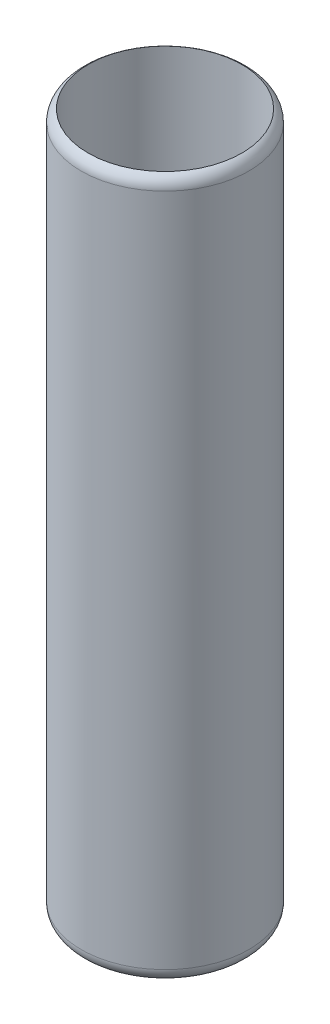
ISO-10303-21;
HEADER;
FILE_DESCRIPTION(('STEP AP214'),'2;1');
FILE_NAME('part.step','',(''),(''),'','','');
FILE_SCHEMA(('AUTOMOTIVE_DESIGN { 1 0 10303 214 1 1 1 1 }'));
ENDSEC;
DATA;
#1=APPLICATION_CONTEXT('core data for automotive mechanical design processes');
#2=APPLICATION_PROTOCOL_DEFINITION('international standard','automotive_design',2000,#1);
#3=PRODUCT_CONTEXT('',#1,'mechanical');
#4=PRODUCT('Part','Part','',(#3));
#5=PRODUCT_RELATED_PRODUCT_CATEGORY('part','',(#4));
#6=PRODUCT_DEFINITION_FORMATION('','',#4);
#7=PRODUCT_DEFINITION_CONTEXT('part definition',#1,'design');
#8=PRODUCT_DEFINITION('design','',#6,#7);
#9=PRODUCT_DEFINITION_SHAPE('','',#8);
#10=(LENGTH_UNIT() NAMED_UNIT(*) SI_UNIT(.MILLI.,.METRE.));
#11=(NAMED_UNIT(*) PLANE_ANGLE_UNIT() SI_UNIT($,.RADIAN.));
#12=(NAMED_UNIT(*) SI_UNIT($,.STERADIAN.) SOLID_ANGLE_UNIT());
#13=UNCERTAINTY_MEASURE_WITH_UNIT(LENGTH_MEASURE(1.E-05),#10,'distance_accuracy_value','');
#14=(GEOMETRIC_REPRESENTATION_CONTEXT(3) GLOBAL_UNCERTAINTY_ASSIGNED_CONTEXT((#13)) GLOBAL_UNIT_ASSIGNED_CONTEXT((#10,
#11,#12)) REPRESENTATION_CONTEXT('',''));
#15=CARTESIAN_POINT('',(0.,0.,0.));
#16=DIRECTION('',(0.,0.,1.));
#17=DIRECTION('',(1.,0.,0.));
#18=AXIS2_PLACEMENT_3D('',#15,#16,#17);
#19=CARTESIAN_POINT('',(0.,50.,0.));
#20=DIRECTION('',(0.,-1.,0.));
#21=DIRECTION('',(0.,0.,-1.));
#22=AXIS2_PLACEMENT_3D('',#19,#20,#21);
#23=CYLINDRICAL_SURFACE('',#22,6.);
#24=CARTESIAN_POINT('',(0.,0.866025403784436,0.));
#25=DIRECTION('',(0.,-1.,0.));
#26=DIRECTION('',(0.,0.,-1.));
#27=AXIS2_PLACEMENT_3D('',#24,#25,#26);
#28=CIRCLE('',#27,6.);
#29=CARTESIAN_POINT('',(0.,0.866025403784436,-6.));
#30=VERTEX_POINT('',#29);
#31=EDGE_CURVE('E10',#30,#30,#28,.F.);
#32=ORIENTED_EDGE('',*,*,#31,.T.);
#33=EDGE_LOOP('',(#32));
#34=FACE_BOUND('',#33,.T.);
#35=CARTESIAN_POINT('',(0.,49.1339745962156,0.));
#36=DIRECTION('',(0.,1.,0.));
#37=DIRECTION('',(0.,0.,1.));
#38=AXIS2_PLACEMENT_3D('',#35,#36,#37);
#39=CIRCLE('',#38,6.);
#40=CARTESIAN_POINT('',(0.,49.1339745962156,6.));
#41=VERTEX_POINT('',#40);
#42=EDGE_CURVE('E42',#41,#41,#39,.F.);
#43=ORIENTED_EDGE('',*,*,#42,.T.);
#44=EDGE_LOOP('',(#43));
#45=FACE_BOUND('',#44,.T.);
#46=ADVANCED_FACE('F35',(#34,#45),#23,.T.);
#47=CARTESIAN_POINT('',(0.,0.,0.));
#48=DIRECTION('',(0.,1.,0.));
#49=DIRECTION('',(0.,0.,1.));
#50=AXIS2_PLACEMENT_3D('',#47,#48,#49);
#51=CYLINDRICAL_SURFACE('',#50,5.5);
#52=CARTESIAN_POINT('',(0.,0.,0.));
#53=DIRECTION('',(0.,1.,0.));
#54=DIRECTION('',(0.,0.,1.));
#55=AXIS2_PLACEMENT_3D('',#52,#53,#54);
#56=CIRCLE('',#55,5.5);
#57=CARTESIAN_POINT('',(0.,0.,5.5));
#58=VERTEX_POINT('',#57);
#59=EDGE_CURVE('E46',#58,#58,#56,.T.);
#60=ORIENTED_EDGE('',*,*,#59,.F.);
#61=EDGE_LOOP('',(#60));
#62=FACE_BOUND('',#61,.T.);
#63=CARTESIAN_POINT('',(0.,50.,0.));
#64=DIRECTION('',(0.,1.,0.));
#65=DIRECTION('',(0.,0.,1.));
#66=AXIS2_PLACEMENT_3D('',#63,#64,#65);
#67=CIRCLE('',#66,5.5);
#68=CARTESIAN_POINT('',(0.,50.,5.5));
#69=VERTEX_POINT('',#68);
#70=EDGE_CURVE('E50',#69,#69,#67,.T.);
#71=ORIENTED_EDGE('',*,*,#70,.T.);
#72=EDGE_LOOP('',(#71));
#73=FACE_BOUND('',#72,.T.);
#74=ADVANCED_FACE('F56',(#62,#73),#51,.F.);
#75=CARTESIAN_POINT('',(0.,49.1339745962156,0.));
#76=DIRECTION('',(0.,1.,0.));
#77=DIRECTION('',(0.,0.,1.));
#78=AXIS2_PLACEMENT_3D('',#75,#76,#77);
#79=TOROIDAL_SURFACE('',#78,5.,1.);
#80=ORIENTED_EDGE('',*,*,#42,.F.);
#81=EDGE_LOOP('',(#80));
#82=FACE_BOUND('',#81,.T.);
#83=ORIENTED_EDGE('',*,*,#70,.F.);
#84=EDGE_LOOP('',(#83));
#85=FACE_BOUND('',#84,.T.);
#86=ADVANCED_FACE('F58',(#82,#85),#79,.T.);
#87=CARTESIAN_POINT('',(0.,0.866025403784438,0.));
#88=DIRECTION('',(0.,-1.,0.));
#89=DIRECTION('',(0.,0.,-1.));
#90=AXIS2_PLACEMENT_3D('',#87,#88,#89);
#91=TOROIDAL_SURFACE('',#90,5.,1.);
#92=ORIENTED_EDGE('',*,*,#59,.T.);
#93=EDGE_LOOP('',(#92));
#94=FACE_BOUND('',#93,.T.);
#95=ORIENTED_EDGE('',*,*,#31,.F.);
#96=EDGE_LOOP('',(#95));
#97=FACE_BOUND('',#96,.T.);
#98=ADVANCED_FACE('F37',(#94,#97),#91,.T.);
#99=CLOSED_SHELL('',(#46,#74,#86,#98));
#100=MANIFOLD_SOLID_BREP('B2',#99);
#101=ADVANCED_BREP_SHAPE_REPRESENTATION('',(#18,#100),#14);
#102=SHAPE_DEFINITION_REPRESENTATION(#9,#101);
ENDSEC;
END-ISO-10303-21;
